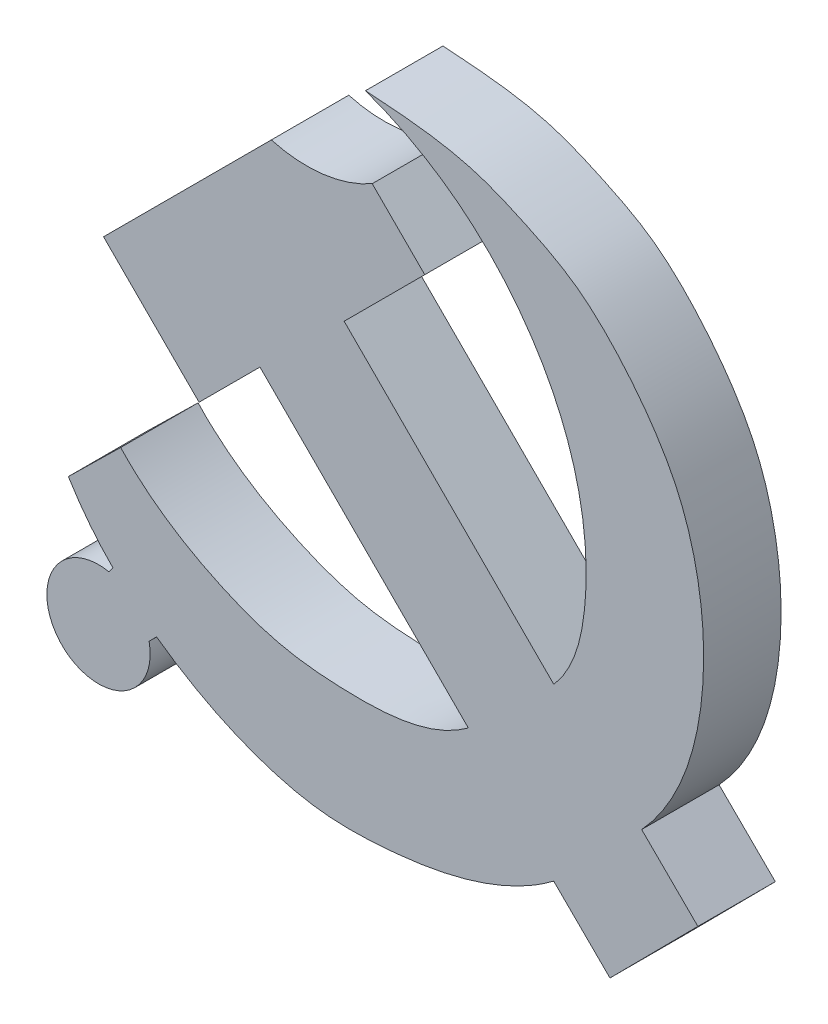
ISO-10303-21;
HEADER;
FILE_DESCRIPTION(('STEP AP214'),'2;1');
FILE_NAME('part.step','',(''),(''),'','','');
FILE_SCHEMA(('AUTOMOTIVE_DESIGN { 1 0 10303 214 1 1 1 1 }'));
ENDSEC;
DATA;
#1=APPLICATION_CONTEXT('core data for automotive mechanical design processes');
#2=APPLICATION_PROTOCOL_DEFINITION('international standard','automotive_design',2000,#1);
#3=PRODUCT_CONTEXT('',#1,'mechanical');
#4=PRODUCT('Part','Part','',(#3));
#5=PRODUCT_RELATED_PRODUCT_CATEGORY('part','',(#4));
#6=PRODUCT_DEFINITION_FORMATION('','',#4);
#7=PRODUCT_DEFINITION_CONTEXT('part definition',#1,'design');
#8=PRODUCT_DEFINITION('design','',#6,#7);
#9=PRODUCT_DEFINITION_SHAPE('','',#8);
#10=(LENGTH_UNIT() NAMED_UNIT(*) SI_UNIT(.MILLI.,.METRE.));
#11=(NAMED_UNIT(*) PLANE_ANGLE_UNIT() SI_UNIT($,.RADIAN.));
#12=(NAMED_UNIT(*) SI_UNIT($,.STERADIAN.) SOLID_ANGLE_UNIT());
#13=UNCERTAINTY_MEASURE_WITH_UNIT(LENGTH_MEASURE(1.E-05),#10,'distance_accuracy_value','');
#14=(GEOMETRIC_REPRESENTATION_CONTEXT(3) GLOBAL_UNCERTAINTY_ASSIGNED_CONTEXT((#13)) GLOBAL_UNIT_ASSIGNED_CONTEXT((#10,
#11,#12)) REPRESENTATION_CONTEXT('',''));
#15=CARTESIAN_POINT('',(0.,0.,0.));
#16=DIRECTION('',(0.,0.,1.));
#17=DIRECTION('',(1.,0.,0.));
#18=AXIS2_PLACEMENT_3D('',#15,#16,#17);
#19=CARTESIAN_POINT('',(-89.5504240609144,9.7433315032957,30.));
#20=DIRECTION('',(0.707106781186547,0.707106781186548,0.));
#21=DIRECTION('',(-0.707106781186548,0.707106781186547,0.));
#22=AXIS2_PLACEMENT_3D('',#19,#20,#21);
#23=PLANE('',#22);
#24=DIRECTION('',(0.707106781186548,-0.707106781186547,0.));
#25=VECTOR('',#24,1.);
#26=CARTESIAN_POINT('',(-89.5504240609144,9.7433315032957,0.));
#27=LINE('',#26,#25);
#28=CARTESIAN_POINT('',(-126.557455072708,46.7503625150897,0.));
#29=VERTEX_POINT('',#28);
#30=CARTESIAN_POINT('',(-89.5504240609144,9.7433315032957,0.));
#31=VERTEX_POINT('',#30);
#32=EDGE_CURVE('E204',#29,#31,#27,.T.);
#33=ORIENTED_EDGE('',*,*,#32,.T.);
#34=DIRECTION('',(0.,0.,-1.));
#35=VECTOR('',#34,1.);
#36=CARTESIAN_POINT('',(-89.5504240609144,9.7433315032957,30.));
#37=LINE('',#36,#35);
#38=CARTESIAN_POINT('',(-89.5504240609144,9.7433315032957,30.));
#39=VERTEX_POINT('',#38);
#40=EDGE_CURVE('E11',#39,#31,#37,.T.);
#41=ORIENTED_EDGE('',*,*,#40,.F.);
#42=DIRECTION('',(0.707106781186548,-0.707106781186547,0.));
#43=VECTOR('',#42,1.);
#44=CARTESIAN_POINT('',(-89.5504240609144,9.7433315032957,30.));
#45=LINE('',#44,#43);
#46=CARTESIAN_POINT('',(-126.557455072708,46.7503625150897,30.));
#47=VERTEX_POINT('',#46);
#48=EDGE_CURVE('E267',#47,#39,#45,.T.);
#49=ORIENTED_EDGE('',*,*,#48,.F.);
#50=DIRECTION('',(0.,0.,-1.));
#51=VECTOR('',#50,1.);
#52=CARTESIAN_POINT('',(-126.557455072708,46.7503625150897,30.));
#53=LINE('',#52,#51);
#54=EDGE_CURVE('E200',#47,#29,#53,.T.);
#55=ORIENTED_EDGE('',*,*,#54,.T.);
#56=EDGE_LOOP('',(#33,#41,#49,#55));
#57=FACE_BOUND('',#56,.T.);
#58=ADVANCED_FACE('F36',(#57),#23,.F.);
#59=CARTESIAN_POINT('',(-89.5504240609144,9.7433315032957,30.));
#60=DIRECTION('',(-0.707106781186549,0.707106781186547,0.));
#61=DIRECTION('',(-0.707106781186547,-0.707106781186549,0.));
#62=AXIS2_PLACEMENT_3D('',#59,#60,#61);
#63=PLANE('',#62);
#64=DIRECTION('',(0.707106781186547,0.707106781186548,0.));
#65=VECTOR('',#64,1.);
#66=CARTESIAN_POINT('',(-89.5504240609144,9.7433315032957,0.));
#67=LINE('',#66,#65);
#68=CARTESIAN_POINT('',(-65.9584417908956,33.3353137733145,0.));
#69=VERTEX_POINT('',#68);
#70=EDGE_CURVE('E207',#31,#69,#67,.T.);
#71=ORIENTED_EDGE('',*,*,#70,.T.);
#72=DIRECTION('',(0.,0.,-1.));
#73=VECTOR('',#72,1.);
#74=CARTESIAN_POINT('',(-65.9584417908956,33.3353137733145,30.));
#75=LINE('',#74,#73);
#76=CARTESIAN_POINT('',(-65.9584417908956,33.3353137733145,30.));
#77=VERTEX_POINT('',#76);
#78=EDGE_CURVE('E44',#77,#69,#75,.T.);
#79=ORIENTED_EDGE('',*,*,#78,.F.);
#80=DIRECTION('',(0.707106781186547,0.707106781186548,0.));
#81=VECTOR('',#80,1.);
#82=CARTESIAN_POINT('',(-89.5504240609144,9.7433315032957,30.));
#83=LINE('',#82,#81);
#84=EDGE_CURVE('E131',#39,#77,#83,.T.);
#85=ORIENTED_EDGE('',*,*,#84,.F.);
#86=ORIENTED_EDGE('',*,*,#40,.T.);
#87=EDGE_LOOP('',(#71,#79,#85,#86));
#88=FACE_BOUND('',#87,.T.);
#89=ADVANCED_FACE('F366',(#88),#63,.F.);
#90=CARTESIAN_POINT('',(-65.9584417908956,33.3353137733145,30.));
#91=DIRECTION('',(0.707106781186547,0.707106781186548,0.));
#92=DIRECTION('',(-0.707106781186548,0.707106781186547,0.));
#93=AXIS2_PLACEMENT_3D('',#90,#91,#92);
#94=PLANE('',#93);
#95=DIRECTION('',(0.707106781186548,-0.707106781186547,0.));
#96=VECTOR('',#95,1.);
#97=CARTESIAN_POINT('',(-65.9584417908956,33.3353137733145,0.));
#98=LINE('',#97,#96);
#99=CARTESIAN_POINT('',(14.7631446035794,-47.3862726211604,0.));
#100=VERTEX_POINT('',#99);
#101=EDGE_CURVE('E209',#69,#100,#98,.T.);
#102=ORIENTED_EDGE('',*,*,#101,.T.);
#103=DIRECTION('',(0.,0.,-1.));
#104=VECTOR('',#103,1.);
#105=CARTESIAN_POINT('',(14.7631446035794,-47.3862726211604,30.));
#106=LINE('',#105,#104);
#107=CARTESIAN_POINT('',(14.7631446035794,-47.3862726211604,30.));
#108=VERTEX_POINT('',#107);
#109=EDGE_CURVE('E310',#108,#100,#106,.T.);
#110=ORIENTED_EDGE('',*,*,#109,.F.);
#111=DIRECTION('',(0.707106781186548,-0.707106781186547,0.));
#112=VECTOR('',#111,1.);
#113=CARTESIAN_POINT('',(-65.9584417908956,33.3353137733145,30.));
#114=LINE('',#113,#112);
#115=EDGE_CURVE('E318',#77,#108,#114,.T.);
#116=ORIENTED_EDGE('',*,*,#115,.F.);
#117=ORIENTED_EDGE('',*,*,#78,.T.);
#118=EDGE_LOOP('',(#102,#110,#116,#117));
#119=FACE_BOUND('',#118,.T.);
#120=ADVANCED_FACE('F316',(#119),#94,.F.);
#121=CARTESIAN_POINT('',(14.7631446035794,-47.3862726211604,30.));
#122=CARTESIAN_POINT('',(0.494407810724982,-57.892318184419,30.));
#123=CARTESIAN_POINT('',(-24.8570121269374,-59.6898402709974,30.));
#124=CARTESIAN_POINT('',(-58.1866885205356,-56.8512402754521,30.));
#125=CARTESIAN_POINT('',(-88.6922385289684,-45.382338901724,30.));
#126=CARTESIAN_POINT('',(-109.075510722267,-32.1994511691794,30.));
#127=CARTESIAN_POINT('',(-119.928178623792,-20.6344230595819,30.));
#128=B_SPLINE_CURVE_WITH_KNOTS('',3,(#121,#122,#123,#124,#125,#126,#127),.UNSPECIFIED.,.F.,.F.,
(4,1,1,1,4),(0.,0.341115549121045,0.5079794375683,0.680177261539338,1.),.UNSPECIFIED.);
#129=DIRECTION('',(0.,0.,-1.));
#130=VECTOR('',#129,1.);
#131=SURFACE_OF_LINEAR_EXTRUSION('',#128,#130);
#132=CARTESIAN_POINT('',(14.7631446035794,-47.3862726211604,0.));
#133=CARTESIAN_POINT('',(0.494407810724982,-57.892318184419,0.));
#134=CARTESIAN_POINT('',(-24.8570121269374,-59.6898402709974,0.));
#135=CARTESIAN_POINT('',(-58.1866885205356,-56.8512402754521,0.));
#136=CARTESIAN_POINT('',(-88.6922385289684,-45.382338901724,0.));
#137=CARTESIAN_POINT('',(-109.075510722267,-32.1994511691794,0.));
#138=CARTESIAN_POINT('',(-119.928178623792,-20.6344230595819,0.));
#139=B_SPLINE_CURVE_WITH_KNOTS('',3,(#132,#133,#134,#135,#136,#137,#138),.UNSPECIFIED.,.F.,.F.,
(4,1,1,1,4),(0.,0.341115549121045,0.5079794375683,0.680177261539338,1.),.UNSPECIFIED.);
#140=CARTESIAN_POINT('',(-119.928178623792,-20.6344230595819,0.));
#141=VERTEX_POINT('',#140);
#142=EDGE_CURVE('E211',#100,#141,#139,.T.);
#143=ORIENTED_EDGE('',*,*,#142,.T.);
#144=DIRECTION('',(0.,0.,-1.));
#145=VECTOR('',#144,1.);
#146=CARTESIAN_POINT('',(-119.928178623792,-20.6344230595819,30.));
#147=LINE('',#146,#145);
#148=CARTESIAN_POINT('',(-119.928178623792,-20.6344230595819,30.));
#149=VERTEX_POINT('',#148);
#150=EDGE_CURVE('E307',#149,#141,#147,.T.);
#151=ORIENTED_EDGE('',*,*,#150,.F.);
#152=EDGE_CURVE('E336',#108,#149,#128,.T.);
#153=ORIENTED_EDGE('',*,*,#152,.F.);
#154=ORIENTED_EDGE('',*,*,#109,.T.);
#155=EDGE_LOOP('',(#143,#151,#153,#154));
#156=FACE_BOUND('',#155,.T.);
#157=ADVANCED_FACE('F327',(#156),#131,.F.);
#158=CARTESIAN_POINT('',(-119.928178623792,-20.6344230595819,30.));
#159=DIRECTION('',(0.700170145236899,-0.713976027411943,0.));
#160=DIRECTION('',(0.713976027411943,0.700170145236899,0.));
#161=AXIS2_PLACEMENT_3D('',#158,#159,#160);
#162=PLANE('',#161);
#163=DIRECTION('',(-0.713976027411943,-0.700170145236899,0.));
#164=VECTOR('',#163,1.);
#165=CARTESIAN_POINT('',(-119.928178623792,-20.6344230595819,0.));
#166=LINE('',#165,#164);
#167=CARTESIAN_POINT('',(-140.199044416047,-40.5133188500868,0.));
#168=VERTEX_POINT('',#167);
#169=EDGE_CURVE('E215',#141,#168,#166,.T.);
#170=ORIENTED_EDGE('',*,*,#169,.T.);
#171=DIRECTION('',(0.,0.,-1.));
#172=VECTOR('',#171,1.);
#173=CARTESIAN_POINT('',(-140.199044416047,-40.5133188500868,30.));
#174=LINE('',#173,#172);
#175=CARTESIAN_POINT('',(-140.199044416047,-40.5133188500868,30.));
#176=VERTEX_POINT('',#175);
#177=EDGE_CURVE('E304',#176,#168,#174,.T.);
#178=ORIENTED_EDGE('',*,*,#177,.F.);
#179=DIRECTION('',(-0.713976027411943,-0.700170145236899,0.));
#180=VECTOR('',#179,1.);
#181=CARTESIAN_POINT('',(-119.928178623792,-20.6344230595819,30.));
#182=LINE('',#181,#180);
#183=EDGE_CURVE('E333',#149,#176,#182,.T.);
#184=ORIENTED_EDGE('',*,*,#183,.F.);
#185=ORIENTED_EDGE('',*,*,#150,.T.);
#186=EDGE_LOOP('',(#170,#178,#184,#185));
#187=FACE_BOUND('',#186,.T.);
#188=ADVANCED_FACE('F331',(#187),#162,.F.);
#189=CARTESIAN_POINT('',(-140.199044416047,-40.5133188500868,30.));
#190=CARTESIAN_POINT('',(-132.851023827164,-52.4887807485567,30.));
#191=CARTESIAN_POINT('',(-122.95207577753,-62.4640062081998,30.));
#192=B_SPLINE_CURVE_WITH_KNOTS('',2,(#189,#190,#191),.UNSPECIFIED.,.F.,.F.,(3,3),(0.,1.),.UNSPECIFIED.);
#193=DIRECTION('',(0.,0.,-1.));
#194=VECTOR('',#193,1.);
#195=SURFACE_OF_LINEAR_EXTRUSION('',#192,#194);
#196=CARTESIAN_POINT('',(-140.199044416047,-40.5133188500868,0.));
#197=CARTESIAN_POINT('',(-132.851023827164,-52.4887807485567,0.));
#198=CARTESIAN_POINT('',(-122.95207577753,-62.4640062081998,0.));
#199=B_SPLINE_CURVE_WITH_KNOTS('',2,(#196,#197,#198),.UNSPECIFIED.,.F.,.F.,(3,3),(0.,1.),.UNSPECIFIED.);
#200=CARTESIAN_POINT('',(-122.95207577753,-62.4640062081998,0.));
#201=VERTEX_POINT('',#200);
#202=EDGE_CURVE('E220',#168,#201,#199,.T.);
#203=ORIENTED_EDGE('',*,*,#202,.T.);
#204=DIRECTION('',(0.,0.,-1.));
#205=VECTOR('',#204,1.);
#206=CARTESIAN_POINT('',(-122.95207577753,-62.4640062081998,30.));
#207=LINE('',#206,#205);
#208=CARTESIAN_POINT('',(-122.95207577753,-62.4640062081998,30.));
#209=VERTEX_POINT('',#208);
#210=EDGE_CURVE('E301',#209,#201,#207,.T.);
#211=ORIENTED_EDGE('',*,*,#210,.F.);
#212=EDGE_CURVE('E335',#176,#209,#192,.T.);
#213=ORIENTED_EDGE('',*,*,#212,.F.);
#214=ORIENTED_EDGE('',*,*,#177,.T.);
#215=EDGE_LOOP('',(#203,#211,#213,#214));
#216=FACE_BOUND('',#215,.T.);
#217=ADVANCED_FACE('F354',(#216),#195,.F.);
#218=CARTESIAN_POINT('',(-122.95207577753,-62.4640062081998,30.));
#219=DIRECTION('',(0.806591340996279,-0.591109472627384,0.));
#220=DIRECTION('',(0.591109472627384,0.806591340996279,0.));
#221=AXIS2_PLACEMENT_3D('',#218,#219,#220);
#222=PLANE('',#221);
#223=DIRECTION('',(-0.591109472627384,-0.806591340996279,0.));
#224=VECTOR('',#223,1.);
#225=CARTESIAN_POINT('',(-122.95207577753,-62.4640062081998,0.));
#226=LINE('',#225,#224);
#227=CARTESIAN_POINT('',(-124.511456774429,-64.5918408440119,0.));
#228=VERTEX_POINT('',#227);
#229=EDGE_CURVE('E224',#201,#228,#226,.T.);
#230=ORIENTED_EDGE('',*,*,#229,.T.);
#231=DIRECTION('',(0.,0.,-1.));
#232=VECTOR('',#231,1.);
#233=CARTESIAN_POINT('',(-124.511456774429,-64.5918408440119,30.));
#234=LINE('',#233,#232);
#235=CARTESIAN_POINT('',(-124.511456774429,-64.5918408440119,30.));
#236=VERTEX_POINT('',#235);
#237=EDGE_CURVE('E298',#236,#228,#234,.T.);
#238=ORIENTED_EDGE('',*,*,#237,.F.);
#239=DIRECTION('',(-0.591109472627384,-0.806591340996279,0.));
#240=VECTOR('',#239,1.);
#241=CARTESIAN_POINT('',(-122.95207577753,-62.4640062081998,30.));
#242=LINE('',#241,#240);
#243=EDGE_CURVE('E338',#209,#236,#242,.T.);
#244=ORIENTED_EDGE('',*,*,#243,.F.);
#245=ORIENTED_EDGE('',*,*,#210,.T.);
#246=EDGE_LOOP('',(#230,#238,#244,#245));
#247=FACE_BOUND('',#246,.T.);
#248=ADVANCED_FACE('F358',(#247),#222,.F.);
#249=CARTESIAN_POINT('',(-128.502024505303,-84.2038228834134,30.));
#250=DIRECTION('',(0.,0.,-1.));
#251=DIRECTION('',(-1.,0.,0.));
#252=AXIS2_PLACEMENT_3D('',#249,#250,#251);
#253=CYLINDRICAL_SURFACE('',#252,20.0138569578305);
#254=CARTESIAN_POINT('',(-128.502024505303,-84.2038228834134,0.));
#255=DIRECTION('',(0.,0.,1.));
#256=DIRECTION('',(1.,0.,0.));
#257=AXIS2_PLACEMENT_3D('',#254,#255,#256);
#258=CIRCLE('',#257,20.0138569578305);
#259=CARTESIAN_POINT('',(-108.909761073037,-80.1175429212465,0.));
#260=VERTEX_POINT('',#259);
#261=EDGE_CURVE('E229',#228,#260,#258,.T.);
#262=ORIENTED_EDGE('',*,*,#261,.T.);
#263=DIRECTION('',(0.,0.,-1.));
#264=VECTOR('',#263,1.);
#265=CARTESIAN_POINT('',(-108.909761073037,-80.1175429212465,30.));
#266=LINE('',#265,#264);
#267=CARTESIAN_POINT('',(-108.909761073037,-80.1175429212465,30.));
#268=VERTEX_POINT('',#267);
#269=EDGE_CURVE('E295',#268,#260,#266,.T.);
#270=ORIENTED_EDGE('',*,*,#269,.F.);
#271=CARTESIAN_POINT('',(-128.502024505303,-84.2038228834134,30.));
#272=DIRECTION('',(0.,0.,1.));
#273=DIRECTION('',(1.,0.,0.));
#274=AXIS2_PLACEMENT_3D('',#271,#272,#273);
#275=CIRCLE('',#274,20.0138569578305);
#276=EDGE_CURVE('E432',#236,#268,#275,.T.);
#277=ORIENTED_EDGE('',*,*,#276,.F.);
#278=ORIENTED_EDGE('',*,*,#237,.T.);
#279=EDGE_LOOP('',(#262,#270,#277,#278));
#280=FACE_BOUND('',#279,.T.);
#281=ADVANCED_FACE('F429',(#280),#253,.T.);
#282=CARTESIAN_POINT('',(-106.018688386985,-77.2023248629328,30.));
#283=DIRECTION('',(-0.710041134700821,0.704160199835784,0.));
#284=DIRECTION('',(-0.704160199835784,-0.710041134700821,0.));
#285=AXIS2_PLACEMENT_3D('',#282,#283,#284);
#286=PLANE('',#285);
#287=DIRECTION('',(0.704160199835784,0.710041134700821,0.));
#288=VECTOR('',#287,1.);
#289=CARTESIAN_POINT('',(-106.018688386985,-77.2023248629328,0.));
#290=LINE('',#289,#288);
#291=CARTESIAN_POINT('',(-106.018688386985,-77.2023248629328,0.));
#292=VERTEX_POINT('',#291);
#293=EDGE_CURVE('E231',#260,#292,#290,.T.);
#294=ORIENTED_EDGE('',*,*,#293,.T.);
#295=DIRECTION('',(0.,0.,-1.));
#296=VECTOR('',#295,1.);
#297=CARTESIAN_POINT('',(-106.018688386985,-77.2023248629328,30.));
#298=LINE('',#297,#296);
#299=CARTESIAN_POINT('',(-106.018688386985,-77.2023248629328,30.));
#300=VERTEX_POINT('',#299);
#301=EDGE_CURVE('E292',#300,#292,#298,.T.);
#302=ORIENTED_EDGE('',*,*,#301,.F.);
#303=DIRECTION('',(0.704160199835784,0.710041134700821,0.));
#304=VECTOR('',#303,1.);
#305=CARTESIAN_POINT('',(-106.018688386985,-77.2023248629328,30.));
#306=LINE('',#305,#304);
#307=EDGE_CURVE('E424',#268,#300,#306,.T.);
#308=ORIENTED_EDGE('',*,*,#307,.F.);
#309=ORIENTED_EDGE('',*,*,#269,.T.);
#310=EDGE_LOOP('',(#294,#302,#308,#309));
#311=FACE_BOUND('',#310,.T.);
#312=ADVANCED_FACE('F423',(#311),#286,.F.);
#313=CARTESIAN_POINT('',(-106.018688386985,-77.2023248629328,30.));
#314=CARTESIAN_POINT('',(-93.7148597580187,-86.0315659423841,30.));
#315=CARTESIAN_POINT('',(-72.9291133803261,-97.2330046890112,30.));
#316=CARTESIAN_POINT('',(-42.0774897670272,-104.912434170071,30.));
#317=CARTESIAN_POINT('',(-17.0247612378548,-104.223351741091,30.));
#318=CARTESIAN_POINT('',(14.0566613873086,-100.072035401347,30.));
#319=CARTESIAN_POINT('',(36.0087287163199,-91.1437358236929,30.));
#320=CARTESIAN_POINT('',(47.8381785703707,-82.2245506865271,30.));
#321=B_SPLINE_CURVE_WITH_KNOTS('',3,(#313,#314,#315,#316,#317,#318,#319,#320),.UNSPECIFIED.,.F.,
.F.,(4,1,1,1,1,4),(0.,0.276360348468008,0.427878613256187,0.575006209242936,0.731440465577424,
1.),.UNSPECIFIED.);
#322=DIRECTION('',(0.,0.,-1.));
#323=VECTOR('',#322,1.);
#324=SURFACE_OF_LINEAR_EXTRUSION('',#321,#323);
#325=CARTESIAN_POINT('',(-106.018688386985,-77.2023248629328,0.));
#326=CARTESIAN_POINT('',(-93.7148597580187,-86.0315659423841,0.));
#327=CARTESIAN_POINT('',(-72.9291133803261,-97.2330046890112,0.));
#328=CARTESIAN_POINT('',(-42.0774897670272,-104.912434170071,0.));
#329=CARTESIAN_POINT('',(-17.0247612378548,-104.223351741091,0.));
#330=CARTESIAN_POINT('',(14.0566613873086,-100.072035401347,0.));
#331=CARTESIAN_POINT('',(36.0087287163199,-91.1437358236929,0.));
#332=CARTESIAN_POINT('',(47.8381785703707,-82.2245506865271,0.));
#333=B_SPLINE_CURVE_WITH_KNOTS('',3,(#325,#326,#327,#328,#329,#330,#331,#332),.UNSPECIFIED.,.F.,
.F.,(4,1,1,1,1,4),(0.,0.276360348468008,0.427878613256187,0.575006209242936,0.731440465577424,
1.),.UNSPECIFIED.);
#334=CARTESIAN_POINT('',(47.8381785703707,-82.2245506865271,0.));
#335=VERTEX_POINT('',#334);
#336=EDGE_CURVE('E233',#292,#335,#333,.T.);
#337=ORIENTED_EDGE('',*,*,#336,.T.);
#338=DIRECTION('',(0.,0.,-1.));
#339=VECTOR('',#338,1.);
#340=CARTESIAN_POINT('',(47.8381785703707,-82.2245506865271,30.));
#341=LINE('',#340,#339);
#342=CARTESIAN_POINT('',(47.8381785703707,-82.2245506865271,30.));
#343=VERTEX_POINT('',#342);
#344=EDGE_CURVE('E289',#343,#335,#341,.T.);
#345=ORIENTED_EDGE('',*,*,#344,.F.);
#346=EDGE_CURVE('E419',#300,#343,#321,.T.);
#347=ORIENTED_EDGE('',*,*,#346,.F.);
#348=ORIENTED_EDGE('',*,*,#301,.T.);
#349=EDGE_LOOP('',(#337,#345,#347,#348));
#350=FACE_BOUND('',#349,.T.);
#351=ADVANCED_FACE('F418',(#350),#324,.F.);
#352=CARTESIAN_POINT('',(47.8381785703707,-82.2245506865271,30.));
#353=DIRECTION('',(0.704160199835784,0.71004113470082,0.));
#354=DIRECTION('',(-0.71004113470082,0.704160199835784,0.));
#355=AXIS2_PLACEMENT_3D('',#352,#353,#354);
#356=PLANE('',#355);
#357=DIRECTION('',(0.71004113470082,-0.704160199835784,0.));
#358=VECTOR('',#357,1.);
#359=CARTESIAN_POINT('',(47.8381785703707,-82.2245506865271,0.));
#360=LINE('',#359,#358);
#361=CARTESIAN_POINT('',(69.6220579761653,-103.828004523108,0.));
#362=VERTEX_POINT('',#361);
#363=EDGE_CURVE('E237',#335,#362,#360,.T.);
#364=ORIENTED_EDGE('',*,*,#363,.T.);
#365=DIRECTION('',(0.,0.,-1.));
#366=VECTOR('',#365,1.);
#367=CARTESIAN_POINT('',(69.6220579761653,-103.828004523108,30.));
#368=LINE('',#367,#366);
#369=CARTESIAN_POINT('',(69.6220579761653,-103.828004523108,30.));
#370=VERTEX_POINT('',#369);
#371=EDGE_CURVE('E286',#370,#362,#368,.T.);
#372=ORIENTED_EDGE('',*,*,#371,.F.);
#373=DIRECTION('',(0.71004113470082,-0.704160199835784,0.));
#374=VECTOR('',#373,1.);
#375=CARTESIAN_POINT('',(47.8381785703707,-82.2245506865271,30.));
#376=LINE('',#375,#374);
#377=EDGE_CURVE('E415',#343,#370,#376,.T.);
#378=ORIENTED_EDGE('',*,*,#377,.F.);
#379=ORIENTED_EDGE('',*,*,#344,.T.);
#380=EDGE_LOOP('',(#364,#372,#378,#379));
#381=FACE_BOUND('',#380,.T.);
#382=ADVANCED_FACE('F412',(#381),#356,.F.);
#383=CARTESIAN_POINT('',(69.6220579761653,-103.828004523108,30.));
#384=DIRECTION('',(-0.710041134700821,0.704160199835784,0.));
#385=DIRECTION('',(-0.704160199835784,-0.710041134700821,0.));
#386=AXIS2_PLACEMENT_3D('',#383,#384,#385);
#387=PLANE('',#386);
#388=DIRECTION('',(0.704160199835784,0.710041134700821,0.));
#389=VECTOR('',#388,1.);
#390=CARTESIAN_POINT('',(69.6220579761653,-103.828004523108,0.));
#391=LINE('',#390,#389);
#392=CARTESIAN_POINT('',(103.685759611633,-69.4798130646898,0.));
#393=VERTEX_POINT('',#392);
#394=EDGE_CURVE('E242',#362,#393,#391,.T.);
#395=ORIENTED_EDGE('',*,*,#394,.T.);
#396=DIRECTION('',(0.,0.,-1.));
#397=VECTOR('',#396,1.);
#398=CARTESIAN_POINT('',(103.685759611633,-69.4798130646898,30.));
#399=LINE('',#398,#397);
#400=CARTESIAN_POINT('',(103.685759611633,-69.4798130646898,30.));
#401=VERTEX_POINT('',#400);
#402=EDGE_CURVE('E283',#401,#393,#399,.T.);
#403=ORIENTED_EDGE('',*,*,#402,.F.);
#404=DIRECTION('',(0.704160199835784,0.710041134700821,0.));
#405=VECTOR('',#404,1.);
#406=CARTESIAN_POINT('',(69.6220579761653,-103.828004523108,30.));
#407=LINE('',#406,#405);
#408=EDGE_CURVE('E406',#370,#401,#407,.T.);
#409=ORIENTED_EDGE('',*,*,#408,.F.);
#410=ORIENTED_EDGE('',*,*,#371,.T.);
#411=EDGE_LOOP('',(#395,#403,#409,#410));
#412=FACE_BOUND('',#411,.T.);
#413=ADVANCED_FACE('F405',(#412),#387,.F.);
#414=CARTESIAN_POINT('',(103.685759611633,-69.4798130646898,30.));
#415=DIRECTION('',(-0.704160199835785,-0.710041134700819,0.));
#416=DIRECTION('',(0.71004113470082,-0.704160199835785,0.));
#417=AXIS2_PLACEMENT_3D('',#414,#415,#416);
#418=PLANE('',#417);
#419=DIRECTION('',(-0.710041134700819,0.704160199835785,0.));
#420=VECTOR('',#419,1.);
#421=CARTESIAN_POINT('',(103.685759611633,-69.4798130646898,0.));
#422=LINE('',#421,#420);
#423=CARTESIAN_POINT('',(81.9018802058401,-47.87635922811,0.));
#424=VERTEX_POINT('',#423);
#425=EDGE_CURVE('E244',#393,#424,#422,.T.);
#426=ORIENTED_EDGE('',*,*,#425,.T.);
#427=DIRECTION('',(0.,0.,-1.));
#428=VECTOR('',#427,1.);
#429=CARTESIAN_POINT('',(81.9018802058401,-47.87635922811,30.));
#430=LINE('',#429,#428);
#431=CARTESIAN_POINT('',(81.9018802058401,-47.87635922811,30.));
#432=VERTEX_POINT('',#431);
#433=EDGE_CURVE('E280',#432,#424,#430,.T.);
#434=ORIENTED_EDGE('',*,*,#433,.F.);
#435=DIRECTION('',(-0.710041134700819,0.704160199835785,0.));
#436=VECTOR('',#435,1.);
#437=CARTESIAN_POINT('',(103.685759611633,-69.4798130646898,30.));
#438=LINE('',#437,#436);
#439=EDGE_CURVE('E401',#401,#432,#438,.T.);
#440=ORIENTED_EDGE('',*,*,#439,.F.);
#441=ORIENTED_EDGE('',*,*,#402,.T.);
#442=EDGE_LOOP('',(#426,#434,#440,#441));
#443=FACE_BOUND('',#442,.T.);
#444=ADVANCED_FACE('F400',(#443),#418,.F.);
#445=CARTESIAN_POINT('',(81.9018802058401,-47.87635922811,30.));
#446=CARTESIAN_POINT('',(97.1118274362207,-31.4575809280111,30.));
#447=CARTESIAN_POINT('',(107.603400970284,1.72230428948739,30.));
#448=CARTESIAN_POINT('',(105.276260592325,44.8157542947364,30.));
#449=CARTESIAN_POINT('',(97.2524593007704,72.15572899535,30.));
#450=CARTESIAN_POINT('',(84.7104603635222,92.5426055296773,30.));
#451=CARTESIAN_POINT('',(71.5371571734249,108.672601965461,30.));
#452=CARTESIAN_POINT('',(55.8976120160437,123.332823339183,30.));
#453=CARTESIAN_POINT('',(37.5313340448204,132.58338803434,30.));
#454=CARTESIAN_POINT('',(11.160613299217,144.072831183488,30.));
#455=CARTESIAN_POINT('',(-10.5670983735909,145.498050050774,30.));
#456=CARTESIAN_POINT('',(-25.0959017045783,146.484591641629,30.));
#457=B_SPLINE_CURVE_WITH_KNOTS('',3,(#445,#446,#447,#448,#449,#450,#451,#452,#453,#454,#455,
#456),.UNSPECIFIED.,.F.,.F.,(4,1,1,1,1,1,1,1,1,4),(0.,0.235883698811512,0.361458488672604,
0.463814442360752,0.540703229600999,0.619017418048904,0.689258712353956,0.770799703588357,
0.840131328013799,1.),.UNSPECIFIED.);
#458=DIRECTION('',(0.,0.,-1.));
#459=VECTOR('',#458,1.);
#460=SURFACE_OF_LINEAR_EXTRUSION('',#457,#459);
#461=CARTESIAN_POINT('',(81.9018802058401,-47.87635922811,0.));
#462=CARTESIAN_POINT('',(97.1118274362207,-31.4575809280111,0.));
#463=CARTESIAN_POINT('',(107.603400970284,1.72230428948739,0.));
#464=CARTESIAN_POINT('',(105.276260592325,44.8157542947364,0.));
#465=CARTESIAN_POINT('',(97.2524593007704,72.15572899535,0.));
#466=CARTESIAN_POINT('',(84.7104603635222,92.5426055296773,0.));
#467=CARTESIAN_POINT('',(71.5371571734249,108.672601965461,0.));
#468=CARTESIAN_POINT('',(55.8976120160437,123.332823339183,0.));
#469=CARTESIAN_POINT('',(37.5313340448204,132.58338803434,0.));
#470=CARTESIAN_POINT('',(11.160613299217,144.072831183488,0.));
#471=CARTESIAN_POINT('',(-10.5670983735909,145.498050050774,0.));
#472=CARTESIAN_POINT('',(-25.0959017045783,146.484591641629,0.));
#473=B_SPLINE_CURVE_WITH_KNOTS('',3,(#461,#462,#463,#464,#465,#466,#467,#468,#469,#470,#471,
#472),.UNSPECIFIED.,.F.,.F.,(4,1,1,1,1,1,1,1,1,4),(0.,0.235883698811512,0.361458488672604,
0.463814442360752,0.540703229600999,0.619017418048904,0.689258712353956,0.770799703588357,
0.840131328013799,1.),.UNSPECIFIED.);
#474=CARTESIAN_POINT('',(-25.0959017045783,146.484591641629,0.));
#475=VERTEX_POINT('',#474);
#476=EDGE_CURVE('E246',#424,#475,#473,.T.);
#477=ORIENTED_EDGE('',*,*,#476,.T.);
#478=DIRECTION('',(0.,0.,-1.));
#479=VECTOR('',#478,1.);
#480=CARTESIAN_POINT('',(-25.0959017045783,146.484591641629,30.));
#481=LINE('',#480,#479);
#482=CARTESIAN_POINT('',(-25.0959017045783,146.484591641629,30.));
#483=VERTEX_POINT('',#482);
#484=EDGE_CURVE('E277',#483,#475,#481,.T.);
#485=ORIENTED_EDGE('',*,*,#484,.F.);
#486=EDGE_CURVE('E397',#432,#483,#457,.T.);
#487=ORIENTED_EDGE('',*,*,#486,.F.);
#488=ORIENTED_EDGE('',*,*,#433,.T.);
#489=EDGE_LOOP('',(#477,#485,#487,#488));
#490=FACE_BOUND('',#489,.T.);
#491=ADVANCED_FACE('F394',(#490),#460,.F.);
#492=CARTESIAN_POINT('',(-25.0959017045783,146.484591641629,30.));
#493=CARTESIAN_POINT('',(-8.9632369417836,140.754746766431,30.));
#494=CARTESIAN_POINT('',(13.873037569692,127.036506771756,30.));
#495=CARTESIAN_POINT('',(36.1007175526144,101.745358423101,30.));
#496=CARTESIAN_POINT('',(48.6697394910976,80.9532246153606,30.));
#497=CARTESIAN_POINT('',(56.8252857060908,59.4822942055356,30.));
#498=CARTESIAN_POINT('',(60.5194051973045,37.995942763962,30.));
#499=CARTESIAN_POINT('',(60.5217841942895,11.9493531509151,30.));
#500=CARTESIAN_POINT('',(56.293651862515,-6.69359227896063,30.));
#501=CARTESIAN_POINT('',(47.8381785703708,-16.1615902049598,30.));
#502=B_SPLINE_CURVE_WITH_KNOTS('',3,(#492,#493,#494,#495,#496,#497,#498,#499,#500,#501),
.UNSPECIFIED.,.F.,.F.,(4,1,1,1,1,1,1,4),(0.,0.253918506380254,0.386919221221739,
0.496446636664599,0.613180360519825,0.725931099698999,0.817885325752877,1.),.UNSPECIFIED.);
#503=DIRECTION('',(0.,0.,-1.));
#504=VECTOR('',#503,1.);
#505=SURFACE_OF_LINEAR_EXTRUSION('',#502,#504);
#506=CARTESIAN_POINT('',(-25.0959017045783,146.484591641629,0.));
#507=CARTESIAN_POINT('',(-8.9632369417836,140.754746766431,0.));
#508=CARTESIAN_POINT('',(13.873037569692,127.036506771756,0.));
#509=CARTESIAN_POINT('',(36.1007175526144,101.745358423101,0.));
#510=CARTESIAN_POINT('',(48.6697394910976,80.9532246153606,0.));
#511=CARTESIAN_POINT('',(56.8252857060908,59.4822942055356,0.));
#512=CARTESIAN_POINT('',(60.5194051973045,37.995942763962,0.));
#513=CARTESIAN_POINT('',(60.5217841942895,11.9493531509151,0.));
#514=CARTESIAN_POINT('',(56.293651862515,-6.69359227896063,0.));
#515=CARTESIAN_POINT('',(47.8381785703708,-16.1615902049598,0.));
#516=B_SPLINE_CURVE_WITH_KNOTS('',3,(#506,#507,#508,#509,#510,#511,#512,#513,#514,#515),
.UNSPECIFIED.,.F.,.F.,(4,1,1,1,1,1,1,4),(0.,0.253918506380254,0.386919221221739,
0.496446636664599,0.613180360519825,0.725931099698999,0.817885325752877,1.),.UNSPECIFIED.);
#517=CARTESIAN_POINT('',(47.8381785703708,-16.1615902049598,0.));
#518=VERTEX_POINT('',#517);
#519=EDGE_CURVE('E250',#475,#518,#516,.T.);
#520=ORIENTED_EDGE('',*,*,#519,.T.);
#521=DIRECTION('',(0.,0.,-1.));
#522=VECTOR('',#521,1.);
#523=CARTESIAN_POINT('',(47.8381785703708,-16.1615902049598,30.));
#524=LINE('',#523,#522);
#525=CARTESIAN_POINT('',(47.8381785703708,-16.1615902049598,30.));
#526=VERTEX_POINT('',#525);
#527=EDGE_CURVE('E274',#526,#518,#524,.T.);
#528=ORIENTED_EDGE('',*,*,#527,.F.);
#529=EDGE_CURVE('E388',#483,#526,#502,.T.);
#530=ORIENTED_EDGE('',*,*,#529,.F.);
#531=ORIENTED_EDGE('',*,*,#484,.T.);
#532=EDGE_LOOP('',(#520,#528,#530,#531));
#533=FACE_BOUND('',#532,.T.);
#534=ADVANCED_FACE('F387',(#533),#505,.F.);
#535=CARTESIAN_POINT('',(-33.3459957117524,65.0225840771634,30.));
#536=DIRECTION('',(-0.707106781186547,-0.707106781186548,0.));
#537=DIRECTION('',(0.707106781186548,-0.707106781186547,0.));
#538=AXIS2_PLACEMENT_3D('',#535,#536,#537);
#539=PLANE('',#538);
#540=DIRECTION('',(-0.707106781186548,0.707106781186547,0.));
#541=VECTOR('',#540,1.);
#542=CARTESIAN_POINT('',(-33.3459957117524,65.0225840771634,0.));
#543=LINE('',#542,#541);
#544=CARTESIAN_POINT('',(-33.3459957117524,65.0225840771634,0.));
#545=VERTEX_POINT('',#544);
#546=EDGE_CURVE('E257',#518,#545,#543,.T.);
#547=ORIENTED_EDGE('',*,*,#546,.T.);
#548=DIRECTION('',(0.,0.,-1.));
#549=VECTOR('',#548,1.);
#550=CARTESIAN_POINT('',(-33.3459957117524,65.0225840771634,30.));
#551=LINE('',#550,#549);
#552=CARTESIAN_POINT('',(-33.3459957117524,65.0225840771634,30.));
#553=VERTEX_POINT('',#552);
#554=EDGE_CURVE('E271',#553,#545,#551,.T.);
#555=ORIENTED_EDGE('',*,*,#554,.F.);
#556=DIRECTION('',(-0.707106781186548,0.707106781186547,0.));
#557=VECTOR('',#556,1.);
#558=CARTESIAN_POINT('',(-33.3459957117524,65.0225840771634,30.));
#559=LINE('',#558,#557);
#560=EDGE_CURVE('E383',#526,#553,#559,.T.);
#561=ORIENTED_EDGE('',*,*,#560,.F.);
#562=ORIENTED_EDGE('',*,*,#527,.T.);
#563=EDGE_LOOP('',(#547,#555,#561,#562));
#564=FACE_BOUND('',#563,.T.);
#565=ADVANCED_FACE('F382',(#564),#539,.F.);
#566=CARTESIAN_POINT('',(-2.12131329555135,96.2472664933645,30.));
#567=DIRECTION('',(-0.707106781186548,0.707106781186547,0.));
#568=DIRECTION('',(-0.707106781186547,-0.707106781186548,0.));
#569=AXIS2_PLACEMENT_3D('',#566,#567,#568);
#570=PLANE('',#569);
#571=DIRECTION('',(0.707106781186547,0.707106781186548,0.));
#572=VECTOR('',#571,1.);
#573=CARTESIAN_POINT('',(-2.12131329555135,96.2472664933645,0.));
#574=LINE('',#573,#572);
#575=CARTESIAN_POINT('',(-2.12131329555135,96.2472664933645,0.));
#576=VERTEX_POINT('',#575);
#577=EDGE_CURVE('E262',#545,#576,#574,.T.);
#578=ORIENTED_EDGE('',*,*,#577,.T.);
#579=DIRECTION('',(0.,0.,-1.));
#580=VECTOR('',#579,1.);
#581=CARTESIAN_POINT('',(-2.12131329555135,96.2472664933645,30.));
#582=LINE('',#581,#580);
#583=CARTESIAN_POINT('',(-2.12131329555135,96.2472664933645,30.));
#584=VERTEX_POINT('',#583);
#585=EDGE_CURVE('E195',#584,#576,#582,.T.);
#586=ORIENTED_EDGE('',*,*,#585,.F.);
#587=DIRECTION('',(0.707106781186547,0.707106781186548,0.));
#588=VECTOR('',#587,1.);
#589=CARTESIAN_POINT('',(-2.12131329555135,96.2472664933645,30.));
#590=LINE('',#589,#588);
#591=EDGE_CURVE('E186',#553,#584,#590,.T.);
#592=ORIENTED_EDGE('',*,*,#591,.F.);
#593=ORIENTED_EDGE('',*,*,#554,.T.);
#594=EDGE_LOOP('',(#578,#586,#592,#593));
#595=FACE_BOUND('',#594,.T.);
#596=ADVANCED_FACE('F378',(#595),#570,.F.);
#597=CARTESIAN_POINT('',(-22.4751803520379,116.601133549851,30.));
#598=DIRECTION('',(-0.707106781186548,-0.707106781186547,0.));
#599=DIRECTION('',(0.707106781186547,-0.707106781186548,0.));
#600=AXIS2_PLACEMENT_3D('',#597,#598,#599);
#601=PLANE('',#600);
#602=DIRECTION('',(-0.707106781186547,0.707106781186548,0.));
#603=VECTOR('',#602,1.);
#604=CARTESIAN_POINT('',(-22.4751803520379,116.601133549851,0.));
#605=LINE('',#604,#603);
#606=CARTESIAN_POINT('',(-22.4751803520379,116.601133549851,0.));
#607=VERTEX_POINT('',#606);
#608=EDGE_CURVE('E194',#576,#607,#605,.T.);
#609=ORIENTED_EDGE('',*,*,#608,.T.);
#610=DIRECTION('',(0.,0.,-1.));
#611=VECTOR('',#610,1.);
#612=CARTESIAN_POINT('',(-22.4751803520379,116.601133549851,30.));
#613=LINE('',#612,#611);
#614=CARTESIAN_POINT('',(-22.4751803520379,116.601133549851,30.));
#615=VERTEX_POINT('',#614);
#616=EDGE_CURVE('E191',#615,#607,#613,.T.);
#617=ORIENTED_EDGE('',*,*,#616,.F.);
#618=DIRECTION('',(-0.707106781186547,0.707106781186548,0.));
#619=VECTOR('',#618,1.);
#620=CARTESIAN_POINT('',(-22.4751803520379,116.601133549851,30.));
#621=LINE('',#620,#619);
#622=EDGE_CURVE('E180',#584,#615,#621,.T.);
#623=ORIENTED_EDGE('',*,*,#622,.F.);
#624=ORIENTED_EDGE('',*,*,#585,.T.);
#625=EDGE_LOOP('',(#609,#617,#623,#624));
#626=FACE_BOUND('',#625,.T.);
#627=ADVANCED_FACE('F192',(#626),#601,.F.);
#628=CARTESIAN_POINT('',(-47.83851955659,161.001650034692,30.));
#629=DIRECTION('',(0.,0.,-1.));
#630=DIRECTION('',(-1.,0.,0.));
#631=AXIS2_PLACEMENT_3D('',#628,#629,#630);
#632=CYLINDRICAL_SURFACE('',#631,51.1341846490761);
#633=CARTESIAN_POINT('',(-47.83851955659,161.001650034692,0.));
#634=DIRECTION('',(0.,0.,-1.));
#635=DIRECTION('',(1.,0.,0.));
#636=AXIS2_PLACEMENT_3D('',#633,#634,#635);
#637=CIRCLE('',#636,51.1341846490761);
#638=CARTESIAN_POINT('',(-61.5638568582451,111.743960729553,0.));
#639=VERTEX_POINT('',#638);
#640=EDGE_CURVE('E117',#607,#639,#637,.T.);
#641=ORIENTED_EDGE('',*,*,#640,.T.);
#642=DIRECTION('',(0.,0.,-1.));
#643=VECTOR('',#642,1.);
#644=CARTESIAN_POINT('',(-61.5638568582451,111.743960729553,30.));
#645=LINE('',#644,#643);
#646=CARTESIAN_POINT('',(-61.5638568582451,111.743960729553,30.));
#647=VERTEX_POINT('',#646);
#648=EDGE_CURVE('E196',#647,#639,#645,.T.);
#649=ORIENTED_EDGE('',*,*,#648,.F.);
#650=CARTESIAN_POINT('',(-47.83851955659,161.001650034692,30.));
#651=DIRECTION('',(0.,0.,-1.));
#652=DIRECTION('',(1.,0.,0.));
#653=AXIS2_PLACEMENT_3D('',#650,#651,#652);
#654=CIRCLE('',#653,51.1341846490761);
#655=EDGE_CURVE('E184',#615,#647,#654,.T.);
#656=ORIENTED_EDGE('',*,*,#655,.F.);
#657=ORIENTED_EDGE('',*,*,#616,.T.);
#658=EDGE_LOOP('',(#641,#649,#656,#657));
#659=FACE_BOUND('',#658,.T.);
#660=ADVANCED_FACE('F198',(#659),#632,.F.);
#661=CARTESIAN_POINT('',(-126.557455072708,46.7503625150897,30.));
#662=DIRECTION('',(0.707106781186548,-0.707106781186547,0.));
#663=DIRECTION('',(0.707106781186547,0.707106781186548,0.));
#664=AXIS2_PLACEMENT_3D('',#661,#662,#663);
#665=PLANE('',#664);
#666=DIRECTION('',(-0.707106781186547,-0.707106781186548,0.));
#667=VECTOR('',#666,1.);
#668=CARTESIAN_POINT('',(-126.557455072708,46.7503625150897,0.));
#669=LINE('',#668,#667);
#670=EDGE_CURVE('E123',#639,#29,#669,.T.);
#671=ORIENTED_EDGE('',*,*,#670,.T.);
#672=ORIENTED_EDGE('',*,*,#54,.F.);
#673=DIRECTION('',(-0.707106781186547,-0.707106781186548,0.));
#674=VECTOR('',#673,1.);
#675=CARTESIAN_POINT('',(-126.557455072708,46.7503625150897,30.));
#676=LINE('',#675,#674);
#677=EDGE_CURVE('E52',#647,#47,#676,.T.);
#678=ORIENTED_EDGE('',*,*,#677,.F.);
#679=ORIENTED_EDGE('',*,*,#648,.T.);
#680=EDGE_LOOP('',(#671,#672,#678,#679));
#681=FACE_BOUND('',#680,.T.);
#682=ADVANCED_FACE('F570',(#681),#665,.F.);
#683=CARTESIAN_POINT('',(-47.83851955659,161.001650034692,30.));
#684=DIRECTION('',(0.,0.,1.));
#685=DIRECTION('',(1.,0.,0.));
#686=AXIS2_PLACEMENT_3D('',#683,#684,#685);
#687=PLANE('',#686);
#688=ORIENTED_EDGE('',*,*,#48,.T.);
#689=ORIENTED_EDGE('',*,*,#84,.T.);
#690=ORIENTED_EDGE('',*,*,#115,.T.);
#691=ORIENTED_EDGE('',*,*,#152,.T.);
#692=ORIENTED_EDGE('',*,*,#183,.T.);
#693=ORIENTED_EDGE('',*,*,#212,.T.);
#694=ORIENTED_EDGE('',*,*,#243,.T.);
#695=ORIENTED_EDGE('',*,*,#276,.T.);
#696=ORIENTED_EDGE('',*,*,#307,.T.);
#697=ORIENTED_EDGE('',*,*,#346,.T.);
#698=ORIENTED_EDGE('',*,*,#377,.T.);
#699=ORIENTED_EDGE('',*,*,#408,.T.);
#700=ORIENTED_EDGE('',*,*,#439,.T.);
#701=ORIENTED_EDGE('',*,*,#486,.T.);
#702=ORIENTED_EDGE('',*,*,#529,.T.);
#703=ORIENTED_EDGE('',*,*,#560,.T.);
#704=ORIENTED_EDGE('',*,*,#591,.T.);
#705=ORIENTED_EDGE('',*,*,#622,.T.);
#706=ORIENTED_EDGE('',*,*,#655,.T.);
#707=ORIENTED_EDGE('',*,*,#677,.T.);
#708=EDGE_LOOP('',(#688,#689,#690,#691,#692,#693,#694,#695,#696,#697,#698,#699,#700,#701,#702,
#703,#704,#705,#706,#707));
#709=FACE_BOUND('',#708,.T.);
#710=ADVANCED_FACE('F182',(#709),#687,.T.);
#711=CARTESIAN_POINT('',(-47.83851955659,161.001650034692,0.));
#712=DIRECTION('',(0.,0.,1.));
#713=DIRECTION('',(1.,0.,0.));
#714=AXIS2_PLACEMENT_3D('',#711,#712,#713);
#715=PLANE('',#714);
#716=ORIENTED_EDGE('',*,*,#32,.F.);
#717=ORIENTED_EDGE('',*,*,#670,.F.);
#718=ORIENTED_EDGE('',*,*,#640,.F.);
#719=ORIENTED_EDGE('',*,*,#608,.F.);
#720=ORIENTED_EDGE('',*,*,#577,.F.);
#721=ORIENTED_EDGE('',*,*,#546,.F.);
#722=ORIENTED_EDGE('',*,*,#519,.F.);
#723=ORIENTED_EDGE('',*,*,#476,.F.);
#724=ORIENTED_EDGE('',*,*,#425,.F.);
#725=ORIENTED_EDGE('',*,*,#394,.F.);
#726=ORIENTED_EDGE('',*,*,#363,.F.);
#727=ORIENTED_EDGE('',*,*,#336,.F.);
#728=ORIENTED_EDGE('',*,*,#293,.F.);
#729=ORIENTED_EDGE('',*,*,#261,.F.);
#730=ORIENTED_EDGE('',*,*,#229,.F.);
#731=ORIENTED_EDGE('',*,*,#202,.F.);
#732=ORIENTED_EDGE('',*,*,#169,.F.);
#733=ORIENTED_EDGE('',*,*,#142,.F.);
#734=ORIENTED_EDGE('',*,*,#101,.F.);
#735=ORIENTED_EDGE('',*,*,#70,.F.);
#736=EDGE_LOOP('',(#716,#717,#718,#719,#720,#721,#722,#723,#724,#725,#726,#727,#728,#729,#730,
#731,#732,#733,#734,#735));
#737=FACE_BOUND('',#736,.T.);
#738=ADVANCED_FACE('F322',(#737),#715,.F.);
#739=CLOSED_SHELL('',(#58,#89,#120,#157,#188,#217,#248,#281,#312,#351,#382,#413,#444,#491,#534,
#565,#596,#627,#660,#682,#710,#738));
#740=MANIFOLD_SOLID_BREP('B2',#739);
#741=ADVANCED_BREP_SHAPE_REPRESENTATION('',(#18,#740),#14);
#742=SHAPE_DEFINITION_REPRESENTATION(#9,#741);
ENDSEC;
END-ISO-10303-21;
